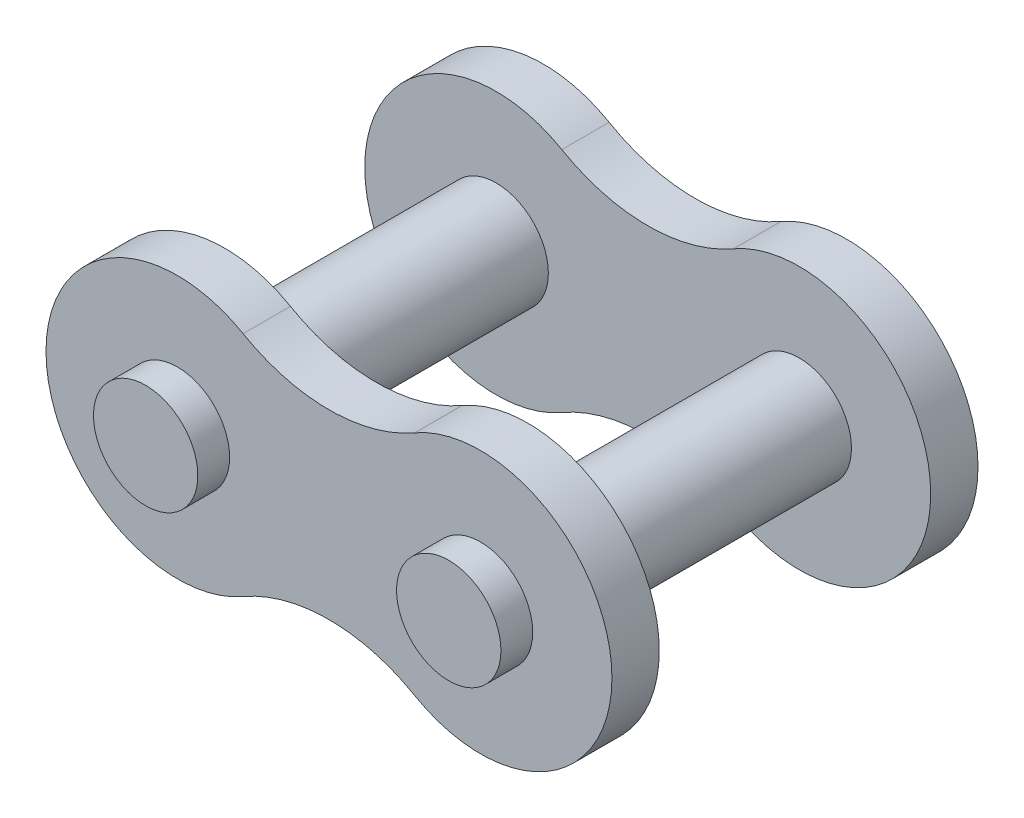
ISO-10303-21;
HEADER;
FILE_DESCRIPTION(('STEP AP214'),'2;1');
FILE_NAME('part.step','',(''),(''),'','','');
FILE_SCHEMA(('AUTOMOTIVE_DESIGN { 1 0 10303 214 1 1 1 1 }'));
ENDSEC;
DATA;
#1=APPLICATION_CONTEXT('core data for automotive mechanical design processes');
#2=APPLICATION_PROTOCOL_DEFINITION('international standard','automotive_design',2000,#1);
#3=PRODUCT_CONTEXT('',#1,'mechanical');
#4=PRODUCT('Part','Part','',(#3));
#5=PRODUCT_RELATED_PRODUCT_CATEGORY('part','',(#4));
#6=PRODUCT_DEFINITION_FORMATION('','',#4);
#7=PRODUCT_DEFINITION_CONTEXT('part definition',#1,'design');
#8=PRODUCT_DEFINITION('design','',#6,#7);
#9=PRODUCT_DEFINITION_SHAPE('','',#8);
#10=(LENGTH_UNIT() NAMED_UNIT(*) SI_UNIT(.MILLI.,.METRE.));
#11=(NAMED_UNIT(*) PLANE_ANGLE_UNIT() SI_UNIT($,.RADIAN.));
#12=(NAMED_UNIT(*) SI_UNIT($,.STERADIAN.) SOLID_ANGLE_UNIT());
#13=UNCERTAINTY_MEASURE_WITH_UNIT(LENGTH_MEASURE(1.E-05),#10,'distance_accuracy_value','');
#14=(GEOMETRIC_REPRESENTATION_CONTEXT(3) GLOBAL_UNCERTAINTY_ASSIGNED_CONTEXT((#13)) GLOBAL_UNIT_ASSIGNED_CONTEXT((#10,
#11,#12)) REPRESENTATION_CONTEXT('',''));
#15=CARTESIAN_POINT('',(0.,0.,0.));
#16=DIRECTION('',(0.,0.,1.));
#17=DIRECTION('',(1.,0.,0.));
#18=AXIS2_PLACEMENT_3D('',#15,#16,#17);
#19=CARTESIAN_POINT('',(9.525,0.,-4.265));
#20=DIRECTION('',(0.,0.,-1.));
#21=DIRECTION('',(1.,0.,0.));
#22=AXIS2_PLACEMENT_3D('',#19,#20,#21);
#23=CYLINDRICAL_SURFACE('',#22,4.13);
#24=DIRECTION('',(0.,0.,1.));
#25=VECTOR('',#24,1.);
#26=CARTESIAN_POINT('',(11.5889165792235,-3.5773102121575,-5.752));
#27=LINE('',#26,#25);
#28=CARTESIAN_POINT('',(11.5889165792235,-3.5773102121575,-5.752));
#29=VERTEX_POINT('',#28);
#30=CARTESIAN_POINT('',(11.5889165792235,-3.5773102121575,-4.265));
#31=VERTEX_POINT('',#30);
#32=EDGE_CURVE('E136',#29,#31,#27,.T.);
#33=ORIENTED_EDGE('',*,*,#32,.T.);
#34=CARTESIAN_POINT('',(9.525,0.,-4.265));
#35=DIRECTION('',(0.,0.,1.));
#36=DIRECTION('',(1.,0.,0.));
#37=AXIS2_PLACEMENT_3D('',#34,#35,#36);
#38=CIRCLE('',#37,4.13);
#39=CARTESIAN_POINT('',(11.5889165792235,3.5773102121575,-4.265));
#40=VERTEX_POINT('',#39);
#41=EDGE_CURVE('E143',#40,#31,#38,.T.);
#42=ORIENTED_EDGE('',*,*,#41,.F.);
#43=DIRECTION('',(0.,0.,1.));
#44=VECTOR('',#43,1.);
#45=CARTESIAN_POINT('',(11.5889165792235,3.5773102121575,-5.752));
#46=LINE('',#45,#44);
#47=CARTESIAN_POINT('',(11.5889165792235,3.5773102121575,-5.752));
#48=VERTEX_POINT('',#47);
#49=EDGE_CURVE('E125',#48,#40,#46,.T.);
#50=ORIENTED_EDGE('',*,*,#49,.F.);
#51=CARTESIAN_POINT('',(9.525,0.,-5.752));
#52=DIRECTION('',(0.,0.,1.));
#53=DIRECTION('',(1.,0.,0.));
#54=AXIS2_PLACEMENT_3D('',#51,#52,#53);
#55=CIRCLE('',#54,4.13);
#56=EDGE_CURVE('E144',#48,#29,#55,.T.);
#57=ORIENTED_EDGE('',*,*,#56,.T.);
#58=EDGE_LOOP('',(#33,#42,#50,#57));
#59=FACE_BOUND('',#58,.T.);
#60=ADVANCED_FACE('F36',(#59),#23,.T.);
#61=CARTESIAN_POINT('',(9.525,0.,4.265));
#62=DIRECTION('',(0.,0.,1.));
#63=DIRECTION('',(-1.,0.,0.));
#64=AXIS2_PLACEMENT_3D('',#61,#62,#63);
#65=CYLINDRICAL_SURFACE('',#64,4.13);
#66=CARTESIAN_POINT('',(9.525,0.,4.265));
#67=DIRECTION('',(0.,0.,1.));
#68=DIRECTION('',(1.,0.,0.));
#69=AXIS2_PLACEMENT_3D('',#66,#67,#68);
#70=CIRCLE('',#69,4.13);
#71=CARTESIAN_POINT('',(11.5889165792235,3.5773102121575,4.265));
#72=VERTEX_POINT('',#71);
#73=CARTESIAN_POINT('',(11.5889165792235,-3.5773102121575,4.265));
#74=VERTEX_POINT('',#73);
#75=EDGE_CURVE('E11',#72,#74,#70,.T.);
#76=ORIENTED_EDGE('',*,*,#75,.T.);
#77=DIRECTION('',(0.,0.,-1.));
#78=VECTOR('',#77,1.);
#79=CARTESIAN_POINT('',(11.5889165792235,-3.5773102121575,5.752));
#80=LINE('',#79,#78);
#81=CARTESIAN_POINT('',(11.5889165792235,-3.5773102121575,5.752));
#82=VERTEX_POINT('',#81);
#83=EDGE_CURVE('E53',#82,#74,#80,.T.);
#84=ORIENTED_EDGE('',*,*,#83,.F.);
#85=CARTESIAN_POINT('',(9.525,0.,5.752));
#86=DIRECTION('',(0.,0.,1.));
#87=DIRECTION('',(1.,0.,0.));
#88=AXIS2_PLACEMENT_3D('',#85,#86,#87);
#89=CIRCLE('',#88,4.13);
#90=CARTESIAN_POINT('',(11.5889165792235,3.5773102121575,5.752));
#91=VERTEX_POINT('',#90);
#92=EDGE_CURVE('E111',#91,#82,#89,.T.);
#93=ORIENTED_EDGE('',*,*,#92,.F.);
#94=DIRECTION('',(0.,0.,-1.));
#95=VECTOR('',#94,1.);
#96=CARTESIAN_POINT('',(11.5889165792235,3.5773102121575,5.752));
#97=LINE('',#96,#95);
#98=EDGE_CURVE('E46',#91,#72,#97,.T.);
#99=ORIENTED_EDGE('',*,*,#98,.T.);
#100=EDGE_LOOP('',(#76,#84,#93,#99));
#101=FACE_BOUND('',#100,.T.);
#102=ADVANCED_FACE('F225',(#101),#65,.T.);
#103=CARTESIAN_POINT('',(19.05,0.,-5.752));
#104=DIRECTION('',(0.,0.,-1.));
#105=DIRECTION('',(1.,0.,0.));
#106=AXIS2_PLACEMENT_3D('',#103,#104,#105);
#107=CYLINDRICAL_SURFACE('',#106,4.13);
#108=CARTESIAN_POINT('',(19.05,0.,-4.265));
#109=DIRECTION('',(0.,0.,1.));
#110=DIRECTION('',(1.,0.,0.));
#111=AXIS2_PLACEMENT_3D('',#108,#109,#110);
#112=CIRCLE('',#111,4.13);
#113=CARTESIAN_POINT('',(16.9860834207765,-3.5773102121575,-4.265));
#114=VERTEX_POINT('',#113);
#115=CARTESIAN_POINT('',(16.9860834207765,3.5773102121575,-4.265));
#116=VERTEX_POINT('',#115);
#117=EDGE_CURVE('E96',#114,#116,#112,.T.);
#118=ORIENTED_EDGE('',*,*,#117,.F.);
#119=DIRECTION('',(0.,0.,1.));
#120=VECTOR('',#119,1.);
#121=CARTESIAN_POINT('',(16.9860834207765,-3.5773102121575,-5.752));
#122=LINE('',#121,#120);
#123=CARTESIAN_POINT('',(16.9860834207765,-3.5773102121575,-5.752));
#124=VERTEX_POINT('',#123);
#125=EDGE_CURVE('E100',#124,#114,#122,.T.);
#126=ORIENTED_EDGE('',*,*,#125,.F.);
#127=CARTESIAN_POINT('',(19.05,0.,-5.752));
#128=DIRECTION('',(0.,0.,1.));
#129=DIRECTION('',(1.,0.,0.));
#130=AXIS2_PLACEMENT_3D('',#127,#128,#129);
#131=CIRCLE('',#130,4.13);
#132=CARTESIAN_POINT('',(16.9860834207765,3.5773102121575,-5.752));
#133=VERTEX_POINT('',#132);
#134=EDGE_CURVE('E131',#124,#133,#131,.T.);
#135=ORIENTED_EDGE('',*,*,#134,.T.);
#136=DIRECTION('',(0.,0.,1.));
#137=VECTOR('',#136,1.);
#138=CARTESIAN_POINT('',(16.9860834207765,3.5773102121575,-5.752));
#139=LINE('',#138,#137);
#140=EDGE_CURVE('E129',#133,#116,#139,.T.);
#141=ORIENTED_EDGE('',*,*,#140,.T.);
#142=EDGE_LOOP('',(#118,#126,#135,#141));
#143=FACE_BOUND('',#142,.T.);
#144=ADVANCED_FACE('F178',(#143),#107,.T.);
#145=CARTESIAN_POINT('',(14.2875,-8.25466496897361,-5.752));
#146=DIRECTION('',(0.,0.,-1.));
#147=DIRECTION('',(1.,0.,0.));
#148=AXIS2_PLACEMENT_3D('',#145,#146,#147);
#149=CYLINDRICAL_SURFACE('',#148,5.4);
#150=CARTESIAN_POINT('',(14.2875,-8.25466496897361,-4.265));
#151=DIRECTION('',(0.,0.,1.));
#152=DIRECTION('',(1.,0.,0.));
#153=AXIS2_PLACEMENT_3D('',#150,#151,#152);
#154=CIRCLE('',#153,5.4);
#155=EDGE_CURVE('E132',#114,#31,#154,.T.);
#156=ORIENTED_EDGE('',*,*,#155,.T.);
#157=ORIENTED_EDGE('',*,*,#32,.F.);
#158=CARTESIAN_POINT('',(14.2875,-8.25466496897361,-5.752));
#159=DIRECTION('',(0.,0.,1.));
#160=DIRECTION('',(1.,0.,0.));
#161=AXIS2_PLACEMENT_3D('',#158,#159,#160);
#162=CIRCLE('',#161,5.4);
#163=EDGE_CURVE('E137',#124,#29,#162,.T.);
#164=ORIENTED_EDGE('',*,*,#163,.F.);
#165=ORIENTED_EDGE('',*,*,#125,.T.);
#166=EDGE_LOOP('',(#156,#157,#164,#165));
#167=FACE_BOUND('',#166,.T.);
#168=ADVANCED_FACE('F172',(#167),#149,.F.);
#169=CARTESIAN_POINT('',(14.2875,8.25466496897361,-5.752));
#170=DIRECTION('',(0.,0.,-1.));
#171=DIRECTION('',(1.,0.,0.));
#172=AXIS2_PLACEMENT_3D('',#169,#170,#171);
#173=CYLINDRICAL_SURFACE('',#172,5.4);
#174=CARTESIAN_POINT('',(14.2875,8.25466496897361,-4.265));
#175=DIRECTION('',(0.,0.,1.));
#176=DIRECTION('',(1.,0.,0.));
#177=AXIS2_PLACEMENT_3D('',#174,#175,#176);
#178=CIRCLE('',#177,5.4);
#179=EDGE_CURVE('E128',#40,#116,#178,.T.);
#180=ORIENTED_EDGE('',*,*,#179,.T.);
#181=ORIENTED_EDGE('',*,*,#140,.F.);
#182=CARTESIAN_POINT('',(14.2875,8.25466496897361,-5.752));
#183=DIRECTION('',(0.,0.,1.));
#184=DIRECTION('',(1.,0.,0.));
#185=AXIS2_PLACEMENT_3D('',#182,#183,#184);
#186=CIRCLE('',#185,5.4);
#187=EDGE_CURVE('E140',#48,#133,#186,.T.);
#188=ORIENTED_EDGE('',*,*,#187,.F.);
#189=ORIENTED_EDGE('',*,*,#49,.T.);
#190=EDGE_LOOP('',(#180,#181,#188,#189));
#191=FACE_BOUND('',#190,.T.);
#192=ADVANCED_FACE('F181',(#191),#173,.F.);
#193=CARTESIAN_POINT('',(7.885,0.,-6.75));
#194=DIRECTION('',(0.,0.,1.));
#195=DIRECTION('',(1.,0.,0.));
#196=AXIS2_PLACEMENT_3D('',#193,#194,#195);
#197=PLANE('',#196);
#198=CARTESIAN_POINT('',(9.525,0.,-6.75));
#199=DIRECTION('',(0.,0.,-1.));
#200=DIRECTION('',(-1.,0.,0.));
#201=AXIS2_PLACEMENT_3D('',#198,#199,#200);
#202=CIRCLE('',#201,1.64);
#203=CARTESIAN_POINT('',(7.885,0.,-6.75));
#204=VERTEX_POINT('',#203);
#205=EDGE_CURVE('E114',#204,#204,#202,.T.);
#206=ORIENTED_EDGE('',*,*,#205,.T.);
#207=EDGE_LOOP('',(#206));
#208=FACE_BOUND('',#207,.T.);
#209=ADVANCED_FACE('F268',(#208),#197,.F.);
#210=CARTESIAN_POINT('',(9.525,0.,-6.75));
#211=DIRECTION('',(0.,0.,1.));
#212=DIRECTION('',(-1.,0.,0.));
#213=AXIS2_PLACEMENT_3D('',#210,#211,#212);
#214=CYLINDRICAL_SURFACE('',#213,1.64);
#215=CARTESIAN_POINT('',(9.525,0.,-5.752));
#216=DIRECTION('',(0.,0.,1.));
#217=DIRECTION('',(1.,0.,0.));
#218=AXIS2_PLACEMENT_3D('',#215,#216,#217);
#219=CIRCLE('',#218,1.64);
#220=CARTESIAN_POINT('',(11.165,0.,-5.752));
#221=VERTEX_POINT('',#220);
#222=EDGE_CURVE('E141',#221,#221,#219,.T.);
#223=ORIENTED_EDGE('',*,*,#222,.F.);
#224=EDGE_LOOP('',(#223));
#225=FACE_BOUND('',#224,.T.);
#226=ORIENTED_EDGE('',*,*,#205,.F.);
#227=EDGE_LOOP('',(#226));
#228=FACE_BOUND('',#227,.T.);
#229=ADVANCED_FACE('F264',(#225,#228),#214,.T.);
#230=CARTESIAN_POINT('',(9.525,0.,-6.75));
#231=DIRECTION('',(0.,0.,1.));
#232=DIRECTION('',(-1.,0.,0.));
#233=AXIS2_PLACEMENT_3D('',#230,#231,#232);
#234=CYLINDRICAL_SURFACE('',#233,1.64);
#235=CARTESIAN_POINT('',(9.525,0.,6.75));
#236=DIRECTION('',(0.,0.,-1.));
#237=DIRECTION('',(-1.,0.,0.));
#238=AXIS2_PLACEMENT_3D('',#235,#236,#237);
#239=CIRCLE('',#238,1.64);
#240=CARTESIAN_POINT('',(7.885,0.,6.75));
#241=VERTEX_POINT('',#240);
#242=EDGE_CURVE('E110',#241,#241,#239,.T.);
#243=ORIENTED_EDGE('',*,*,#242,.T.);
#244=EDGE_LOOP('',(#243));
#245=FACE_BOUND('',#244,.T.);
#246=CARTESIAN_POINT('',(9.525,0.,5.752));
#247=DIRECTION('',(0.,0.,1.));
#248=DIRECTION('',(1.,0.,0.));
#249=AXIS2_PLACEMENT_3D('',#246,#247,#248);
#250=CIRCLE('',#249,1.64);
#251=CARTESIAN_POINT('',(11.165,0.,5.752));
#252=VERTEX_POINT('',#251);
#253=EDGE_CURVE('E107',#252,#252,#250,.T.);
#254=ORIENTED_EDGE('',*,*,#253,.T.);
#255=EDGE_LOOP('',(#254));
#256=FACE_BOUND('',#255,.T.);
#257=ADVANCED_FACE('F267',(#245,#256),#234,.T.);
#258=CARTESIAN_POINT('',(9.525,0.,6.75));
#259=DIRECTION('',(0.,0.,-1.));
#260=DIRECTION('',(0.,-1.,0.));
#261=AXIS2_PLACEMENT_3D('',#258,#259,#260);
#262=PLANE('',#261);
#263=ORIENTED_EDGE('',*,*,#242,.F.);
#264=EDGE_LOOP('',(#263));
#265=FACE_BOUND('',#264,.T.);
#266=ADVANCED_FACE('F287',(#265),#262,.F.);
#267=CARTESIAN_POINT('',(16.66875,4.12733248448681,5.752));
#268=DIRECTION('',(0.,0.,1.));
#269=DIRECTION('',(1.,0.,0.));
#270=AXIS2_PLACEMENT_3D('',#267,#268,#269);
#271=PLANE('',#270);
#272=CARTESIAN_POINT('',(14.2875,8.25466496897361,5.752));
#273=DIRECTION('',(0.,0.,1.));
#274=DIRECTION('',(1.,0.,0.));
#275=AXIS2_PLACEMENT_3D('',#272,#273,#274);
#276=CIRCLE('',#275,5.4);
#277=CARTESIAN_POINT('',(16.9860834207765,3.5773102121575,5.752));
#278=VERTEX_POINT('',#277);
#279=EDGE_CURVE('E190',#91,#278,#276,.T.);
#280=ORIENTED_EDGE('',*,*,#279,.F.);
#281=ORIENTED_EDGE('',*,*,#92,.T.);
#282=CARTESIAN_POINT('',(14.2875,-8.25466496897361,5.752));
#283=DIRECTION('',(0.,0.,1.));
#284=DIRECTION('',(1.,0.,0.));
#285=AXIS2_PLACEMENT_3D('',#282,#283,#284);
#286=CIRCLE('',#285,5.4);
#287=CARTESIAN_POINT('',(16.9860834207765,-3.5773102121575,5.752));
#288=VERTEX_POINT('',#287);
#289=EDGE_CURVE('E123',#288,#82,#286,.T.);
#290=ORIENTED_EDGE('',*,*,#289,.F.);
#291=CARTESIAN_POINT('',(19.05,0.,5.752));
#292=DIRECTION('',(0.,0.,1.));
#293=DIRECTION('',(1.,0.,0.));
#294=AXIS2_PLACEMENT_3D('',#291,#292,#293);
#295=CIRCLE('',#294,4.13);
#296=EDGE_CURVE('E116',#288,#278,#295,.T.);
#297=ORIENTED_EDGE('',*,*,#296,.T.);
#298=EDGE_LOOP('',(#280,#281,#290,#297));
#299=FACE_BOUND('',#298,.T.);
#300=CARTESIAN_POINT('',(19.05,0.,5.752));
#301=DIRECTION('',(0.,0.,1.));
#302=DIRECTION('',(1.,0.,0.));
#303=AXIS2_PLACEMENT_3D('',#300,#301,#302);
#304=CIRCLE('',#303,1.64);
#305=CARTESIAN_POINT('',(20.69,0.,5.752));
#306=VERTEX_POINT('',#305);
#307=EDGE_CURVE('E164',#306,#306,#304,.T.);
#308=ORIENTED_EDGE('',*,*,#307,.F.);
#309=EDGE_LOOP('',(#308));
#310=FACE_BOUND('',#309,.T.);
#311=ORIENTED_EDGE('',*,*,#253,.F.);
#312=EDGE_LOOP('',(#311));
#313=FACE_BOUND('',#312,.T.);
#314=ADVANCED_FACE('F108',(#299,#310,#313),#271,.T.);
#315=CARTESIAN_POINT('',(16.66875,4.12733248448681,4.265));
#316=DIRECTION('',(0.,0.,1.));
#317=DIRECTION('',(1.,0.,0.));
#318=AXIS2_PLACEMENT_3D('',#315,#316,#317);
#319=PLANE('',#318);
#320=CARTESIAN_POINT('',(14.2875,-8.25466496897361,4.265));
#321=DIRECTION('',(0.,0.,1.));
#322=DIRECTION('',(1.,0.,0.));
#323=AXIS2_PLACEMENT_3D('',#320,#321,#322);
#324=CIRCLE('',#323,5.4);
#325=CARTESIAN_POINT('',(16.9860834207765,-3.5773102121575,4.265));
#326=VERTEX_POINT('',#325);
#327=EDGE_CURVE('E163',#326,#74,#324,.T.);
#328=ORIENTED_EDGE('',*,*,#327,.T.);
#329=ORIENTED_EDGE('',*,*,#75,.F.);
#330=CARTESIAN_POINT('',(14.2875,8.25466496897361,4.265));
#331=DIRECTION('',(0.,0.,1.));
#332=DIRECTION('',(1.,0.,0.));
#333=AXIS2_PLACEMENT_3D('',#330,#331,#332);
#334=CIRCLE('',#333,5.4);
#335=CARTESIAN_POINT('',(16.9860834207765,3.5773102121575,4.265));
#336=VERTEX_POINT('',#335);
#337=EDGE_CURVE('E160',#72,#336,#334,.T.);
#338=ORIENTED_EDGE('',*,*,#337,.T.);
#339=CARTESIAN_POINT('',(19.05,0.,4.265));
#340=DIRECTION('',(0.,0.,1.));
#341=DIRECTION('',(1.,0.,0.));
#342=AXIS2_PLACEMENT_3D('',#339,#340,#341);
#343=CIRCLE('',#342,4.13);
#344=EDGE_CURVE('E124',#326,#336,#343,.T.);
#345=ORIENTED_EDGE('',*,*,#344,.F.);
#346=EDGE_LOOP('',(#328,#329,#338,#345));
#347=FACE_BOUND('',#346,.T.);
#348=CARTESIAN_POINT('',(19.05,0.,4.265));
#349=DIRECTION('',(0.,0.,1.));
#350=DIRECTION('',(1.,0.,0.));
#351=AXIS2_PLACEMENT_3D('',#348,#349,#350);
#352=CIRCLE('',#351,1.64);
#353=CARTESIAN_POINT('',(20.69,0.,4.265));
#354=VERTEX_POINT('',#353);
#355=EDGE_CURVE('E192',#354,#354,#352,.T.);
#356=ORIENTED_EDGE('',*,*,#355,.T.);
#357=EDGE_LOOP('',(#356));
#358=FACE_BOUND('',#357,.T.);
#359=CARTESIAN_POINT('',(9.525,0.,4.265));
#360=DIRECTION('',(0.,0.,1.));
#361=DIRECTION('',(1.,0.,0.));
#362=AXIS2_PLACEMENT_3D('',#359,#360,#361);
#363=CIRCLE('',#362,1.64);
#364=CARTESIAN_POINT('',(11.165,0.,4.265));
#365=VERTEX_POINT('',#364);
#366=EDGE_CURVE('E236',#365,#365,#363,.T.);
#367=ORIENTED_EDGE('',*,*,#366,.T.);
#368=EDGE_LOOP('',(#367));
#369=FACE_BOUND('',#368,.T.);
#370=ADVANCED_FACE('F230',(#347,#358,#369),#319,.F.);
#371=CARTESIAN_POINT('',(14.2875,-8.25466496897361,5.752));
#372=DIRECTION('',(0.,0.,1.));
#373=DIRECTION('',(-1.,0.,0.));
#374=AXIS2_PLACEMENT_3D('',#371,#372,#373);
#375=CYLINDRICAL_SURFACE('',#374,5.4);
#376=ORIENTED_EDGE('',*,*,#327,.F.);
#377=DIRECTION('',(0.,0.,-1.));
#378=VECTOR('',#377,1.);
#379=CARTESIAN_POINT('',(16.9860834207765,-3.5773102121575,5.752));
#380=LINE('',#379,#378);
#381=EDGE_CURVE('E120',#288,#326,#380,.T.);
#382=ORIENTED_EDGE('',*,*,#381,.F.);
#383=ORIENTED_EDGE('',*,*,#289,.T.);
#384=ORIENTED_EDGE('',*,*,#83,.T.);
#385=EDGE_LOOP('',(#376,#382,#383,#384));
#386=FACE_BOUND('',#385,.T.);
#387=ADVANCED_FACE('F229',(#386),#375,.F.);
#388=CARTESIAN_POINT('',(19.05,0.,5.752));
#389=DIRECTION('',(0.,0.,1.));
#390=DIRECTION('',(-1.,0.,0.));
#391=AXIS2_PLACEMENT_3D('',#388,#389,#390);
#392=CYLINDRICAL_SURFACE('',#391,4.13);
#393=ORIENTED_EDGE('',*,*,#344,.T.);
#394=DIRECTION('',(0.,0.,-1.));
#395=VECTOR('',#394,1.);
#396=CARTESIAN_POINT('',(16.9860834207765,3.5773102121575,5.752));
#397=LINE('',#396,#395);
#398=EDGE_CURVE('E40',#278,#336,#397,.T.);
#399=ORIENTED_EDGE('',*,*,#398,.F.);
#400=ORIENTED_EDGE('',*,*,#296,.F.);
#401=ORIENTED_EDGE('',*,*,#381,.T.);
#402=EDGE_LOOP('',(#393,#399,#400,#401));
#403=FACE_BOUND('',#402,.T.);
#404=ADVANCED_FACE('F215',(#403),#392,.T.);
#405=CARTESIAN_POINT('',(14.2875,8.25466496897361,5.752));
#406=DIRECTION('',(0.,0.,1.));
#407=DIRECTION('',(-1.,0.,0.));
#408=AXIS2_PLACEMENT_3D('',#405,#406,#407);
#409=CYLINDRICAL_SURFACE('',#408,5.4);
#410=ORIENTED_EDGE('',*,*,#337,.F.);
#411=ORIENTED_EDGE('',*,*,#98,.F.);
#412=ORIENTED_EDGE('',*,*,#279,.T.);
#413=ORIENTED_EDGE('',*,*,#398,.T.);
#414=EDGE_LOOP('',(#410,#411,#412,#413));
#415=FACE_BOUND('',#414,.T.);
#416=ADVANCED_FACE('F218',(#415),#409,.F.);
#417=CARTESIAN_POINT('',(16.66875,4.12733248448681,-5.752));
#418=DIRECTION('',(0.,0.,1.));
#419=DIRECTION('',(1.,0.,0.));
#420=AXIS2_PLACEMENT_3D('',#417,#418,#419);
#421=PLANE('',#420);
#422=ORIENTED_EDGE('',*,*,#187,.T.);
#423=ORIENTED_EDGE('',*,*,#134,.F.);
#424=ORIENTED_EDGE('',*,*,#163,.T.);
#425=ORIENTED_EDGE('',*,*,#56,.F.);
#426=EDGE_LOOP('',(#422,#423,#424,#425));
#427=FACE_BOUND('',#426,.T.);
#428=CARTESIAN_POINT('',(19.05,0.,-5.752));
#429=DIRECTION('',(0.,0.,1.));
#430=DIRECTION('',(1.,0.,0.));
#431=AXIS2_PLACEMENT_3D('',#428,#429,#430);
#432=CIRCLE('',#431,1.64);
#433=CARTESIAN_POINT('',(20.69,0.,-5.752));
#434=VERTEX_POINT('',#433);
#435=EDGE_CURVE('E196',#434,#434,#432,.T.);
#436=ORIENTED_EDGE('',*,*,#435,.T.);
#437=EDGE_LOOP('',(#436));
#438=FACE_BOUND('',#437,.T.);
#439=ORIENTED_EDGE('',*,*,#222,.T.);
#440=EDGE_LOOP('',(#439));
#441=FACE_BOUND('',#440,.T.);
#442=ADVANCED_FACE('F258',(#427,#438,#441),#421,.F.);
#443=CARTESIAN_POINT('',(16.66875,4.12733248448681,-4.265));
#444=DIRECTION('',(0.,0.,1.));
#445=DIRECTION('',(1.,0.,0.));
#446=AXIS2_PLACEMENT_3D('',#443,#444,#445);
#447=PLANE('',#446);
#448=ORIENTED_EDGE('',*,*,#179,.F.);
#449=ORIENTED_EDGE('',*,*,#41,.T.);
#450=ORIENTED_EDGE('',*,*,#155,.F.);
#451=ORIENTED_EDGE('',*,*,#117,.T.);
#452=EDGE_LOOP('',(#448,#449,#450,#451));
#453=FACE_BOUND('',#452,.T.);
#454=CARTESIAN_POINT('',(19.05,0.,-4.265));
#455=DIRECTION('',(0.,0.,1.));
#456=DIRECTION('',(1.,0.,0.));
#457=AXIS2_PLACEMENT_3D('',#454,#455,#456);
#458=CIRCLE('',#457,1.64);
#459=CARTESIAN_POINT('',(20.69,0.,-4.265));
#460=VERTEX_POINT('',#459);
#461=EDGE_CURVE('E176',#460,#460,#458,.T.);
#462=ORIENTED_EDGE('',*,*,#461,.F.);
#463=EDGE_LOOP('',(#462));
#464=FACE_BOUND('',#463,.T.);
#465=CARTESIAN_POINT('',(9.525,0.,-4.265));
#466=DIRECTION('',(0.,0.,1.));
#467=DIRECTION('',(1.,0.,0.));
#468=AXIS2_PLACEMENT_3D('',#465,#466,#467);
#469=CIRCLE('',#468,1.64);
#470=CARTESIAN_POINT('',(11.165,0.,-4.265));
#471=VERTEX_POINT('',#470);
#472=EDGE_CURVE('E238',#471,#471,#469,.F.);
#473=ORIENTED_EDGE('',*,*,#472,.T.);
#474=EDGE_LOOP('',(#473));
#475=FACE_BOUND('',#474,.T.);
#476=ADVANCED_FACE('F38',(#453,#464,#475),#447,.T.);
#477=CARTESIAN_POINT('',(19.05,0.,-11.3886204845838));
#478=DIRECTION('',(0.,0.,1.));
#479=DIRECTION('',(1.,0.,0.));
#480=AXIS2_PLACEMENT_3D('',#477,#478,#479);
#481=CYLINDRICAL_SURFACE('',#480,1.64);
#482=ORIENTED_EDGE('',*,*,#461,.T.);
#483=EDGE_LOOP('',(#482));
#484=FACE_BOUND('',#483,.T.);
#485=ORIENTED_EDGE('',*,*,#355,.F.);
#486=EDGE_LOOP('',(#485));
#487=FACE_BOUND('',#486,.T.);
#488=ADVANCED_FACE('F255',(#484,#487),#481,.T.);
#489=CARTESIAN_POINT('',(7.885,0.,-6.75));
#490=DIRECTION('',(0.,0.,1.));
#491=DIRECTION('',(1.,0.,0.));
#492=AXIS2_PLACEMENT_3D('',#489,#490,#491);
#493=PLANE('',#492);
#494=CARTESIAN_POINT('',(19.05,0.,-6.75));
#495=DIRECTION('',(0.,0.,1.));
#496=DIRECTION('',(1.,0.,0.));
#497=AXIS2_PLACEMENT_3D('',#494,#495,#496);
#498=CIRCLE('',#497,1.64);
#499=CARTESIAN_POINT('',(20.69,0.,-6.75));
#500=VERTEX_POINT('',#499);
#501=EDGE_CURVE('E201',#500,#500,#498,.F.);
#502=ORIENTED_EDGE('',*,*,#501,.T.);
#503=EDGE_LOOP('',(#502));
#504=FACE_BOUND('',#503,.T.);
#505=ADVANCED_FACE('F248',(#504),#493,.F.);
#506=ORIENTED_EDGE('',*,*,#501,.F.);
#507=EDGE_LOOP('',(#506));
#508=FACE_BOUND('',#507,.T.);
#509=ORIENTED_EDGE('',*,*,#435,.F.);
#510=EDGE_LOOP('',(#509));
#511=FACE_BOUND('',#510,.T.);
#512=ADVANCED_FACE('F250',(#508,#511),#481,.T.);
#513=ORIENTED_EDGE('',*,*,#307,.T.);
#514=EDGE_LOOP('',(#513));
#515=FACE_BOUND('',#514,.T.);
#516=CARTESIAN_POINT('',(19.05,0.,6.75));
#517=DIRECTION('',(0.,0.,1.));
#518=DIRECTION('',(1.,0.,0.));
#519=AXIS2_PLACEMENT_3D('',#516,#517,#518);
#520=CIRCLE('',#519,1.64);
#521=CARTESIAN_POINT('',(20.69,0.,6.75));
#522=VERTEX_POINT('',#521);
#523=EDGE_CURVE('E241',#522,#522,#520,.T.);
#524=ORIENTED_EDGE('',*,*,#523,.F.);
#525=EDGE_LOOP('',(#524));
#526=FACE_BOUND('',#525,.T.);
#527=ADVANCED_FACE('F253',(#515,#526),#481,.T.);
#528=CARTESIAN_POINT('',(19.05,0.,6.75));
#529=DIRECTION('',(0.,0.,1.));
#530=DIRECTION('',(1.,0.,0.));
#531=AXIS2_PLACEMENT_3D('',#528,#529,#530);
#532=PLANE('',#531);
#533=ORIENTED_EDGE('',*,*,#523,.T.);
#534=EDGE_LOOP('',(#533));
#535=FACE_BOUND('',#534,.T.);
#536=ADVANCED_FACE('F306',(#535),#532,.T.);
#537=CARTESIAN_POINT('',(9.525,0.,-23.8745340332197));
#538=DIRECTION('',(0.,0.,1.));
#539=DIRECTION('',(1.,0.,0.));
#540=AXIS2_PLACEMENT_3D('',#537,#538,#539);
#541=CYLINDRICAL_SURFACE('',#540,1.64);
#542=CARTESIAN_POINT('',(11.165,0.,-4.265));
#543=CARTESIAN_POINT('',(11.165,0.,-4.17614583333333));
#544=CARTESIAN_POINT('',(11.165,0.,-4.08729166666667));
#545=CARTESIAN_POINT('',(11.165,0.,-3.90958333333333));
#546=CARTESIAN_POINT('',(11.165,0.,-3.82072916666667));
#547=CARTESIAN_POINT('',(11.165,0.,-3.64302083333334));
#548=CARTESIAN_POINT('',(11.165,0.,-3.55416666666667));
#549=CARTESIAN_POINT('',(11.165,0.,-3.37645833333333));
#550=CARTESIAN_POINT('',(11.165,0.,-3.28760416666667));
#551=CARTESIAN_POINT('',(11.165,0.,-3.10989583333333));
#552=CARTESIAN_POINT('',(11.165,0.,-3.02104166666667));
#553=CARTESIAN_POINT('',(11.165,0.,-2.84333333333334));
#554=CARTESIAN_POINT('',(11.165,0.,-2.75447916666667));
#555=CARTESIAN_POINT('',(11.165,0.,-2.57677083333333));
#556=CARTESIAN_POINT('',(11.165,0.,-2.48791666666667));
#557=CARTESIAN_POINT('',(11.165,0.,-2.31020833333333));
#558=CARTESIAN_POINT('',(11.165,0.,-2.22135416666667));
#559=CARTESIAN_POINT('',(11.165,0.,-2.04364583333333));
#560=CARTESIAN_POINT('',(11.165,0.,-1.95479166666667));
#561=CARTESIAN_POINT('',(11.165,0.,-1.77708333333333));
#562=CARTESIAN_POINT('',(11.165,0.,-1.68822916666667));
#563=CARTESIAN_POINT('',(11.165,0.,-1.51052083333333));
#564=CARTESIAN_POINT('',(11.165,0.,-1.42166666666667));
#565=CARTESIAN_POINT('',(11.165,0.,-1.24395833333333));
#566=CARTESIAN_POINT('',(11.165,0.,-1.15510416666667));
#567=CARTESIAN_POINT('',(11.165,0.,-0.977395833333334));
#568=CARTESIAN_POINT('',(11.165,0.,-0.888541666666667));
#569=CARTESIAN_POINT('',(11.165,0.,-0.710833333333333));
#570=CARTESIAN_POINT('',(11.165,0.,-0.621979166666666));
#571=CARTESIAN_POINT('',(11.165,0.,-0.444270833333333));
#572=CARTESIAN_POINT('',(11.165,0.,-0.355416666666667));
#573=CARTESIAN_POINT('',(11.165,0.,-0.177708333333334));
#574=CARTESIAN_POINT('',(11.165,0.,-0.0888541666666671));
#575=CARTESIAN_POINT('',(11.165,0.,0.0888541666666671));
#576=CARTESIAN_POINT('',(11.165,0.,0.177708333333334));
#577=CARTESIAN_POINT('',(11.165,0.,0.355416666666667));
#578=CARTESIAN_POINT('',(11.165,0.,0.444270833333333));
#579=CARTESIAN_POINT('',(11.165,0.,0.621979166666666));
#580=CARTESIAN_POINT('',(11.165,0.,0.710833333333333));
#581=CARTESIAN_POINT('',(11.165,0.,0.888541666666667));
#582=CARTESIAN_POINT('',(11.165,0.,0.977395833333334));
#583=CARTESIAN_POINT('',(11.165,0.,1.15510416666667));
#584=CARTESIAN_POINT('',(11.165,0.,1.24395833333333));
#585=CARTESIAN_POINT('',(11.165,0.,1.42166666666667));
#586=CARTESIAN_POINT('',(11.165,0.,1.51052083333333));
#587=CARTESIAN_POINT('',(11.165,0.,1.68822916666667));
#588=CARTESIAN_POINT('',(11.165,0.,1.77708333333333));
#589=CARTESIAN_POINT('',(11.165,0.,1.95479166666667));
#590=CARTESIAN_POINT('',(11.165,0.,2.04364583333333));
#591=CARTESIAN_POINT('',(11.165,0.,2.22135416666667));
#592=CARTESIAN_POINT('',(11.165,0.,2.31020833333333));
#593=CARTESIAN_POINT('',(11.165,0.,2.48791666666667));
#594=CARTESIAN_POINT('',(11.165,0.,2.57677083333333));
#595=CARTESIAN_POINT('',(11.165,0.,2.75447916666667));
#596=CARTESIAN_POINT('',(11.165,0.,2.84333333333333));
#597=CARTESIAN_POINT('',(11.165,0.,3.02104166666667));
#598=CARTESIAN_POINT('',(11.165,0.,3.10989583333333));
#599=CARTESIAN_POINT('',(11.165,0.,3.28760416666667));
#600=CARTESIAN_POINT('',(11.165,0.,3.37645833333333));
#601=CARTESIAN_POINT('',(11.165,0.,3.55416666666667));
#602=CARTESIAN_POINT('',(11.165,0.,3.64302083333333));
#603=CARTESIAN_POINT('',(11.165,0.,3.82072916666667));
#604=CARTESIAN_POINT('',(11.165,0.,3.90958333333334));
#605=CARTESIAN_POINT('',(11.165,0.,4.08729166666667));
#606=CARTESIAN_POINT('',(11.165,0.,4.17614583333334));
#607=CARTESIAN_POINT('',(11.165,0.,4.265));
#608=B_SPLINE_CURVE_WITH_KNOTS('',3,(#542,#543,#544,#545,#546,#547,#548,#549,#550,#551,#552,
#553,#554,#555,#556,#557,#558,#559,#560,#561,#562,#563,#564,#565,#566,#567,#568,#569,#570,#571,
#572,#573,#574,#575,#576,#577,#578,#579,#580,#581,#582,#583,#584,#585,#586,#587,#588,#589,#590,
#591,#592,#593,#594,#595,#596,#597,#598,#599,#600,#601,#602,#603,#604,#605,#606,#607),
.UNSPECIFIED.,.F.,.F.,(4,2,2,2,2,2,2,2,2,2,2,2,2,2,2,2,2,2,2,2,2,2,2,2,2,2,2,2,2,2,2,2,4),(0.,
0.266562500000001,0.533124999999999,0.7996875,1.06625,1.3328125,1.599375,1.8659375,2.1325,
2.3990625,2.665625,2.9321875,3.19875,3.4653125,3.731875,3.9984375,4.265,4.5315625,4.798125,
5.0646875,5.33125,5.5978125,5.864375,6.1309375,6.3975,6.6640625,6.930625,7.1971875,7.46375,
7.7303125,7.996875,8.26343750000001,8.53),.UNSPECIFIED.);
#609=EDGE_CURVE('BSEAM310',#471,#365,#608,.T.);
#610=ORIENTED_EDGE('',*,*,#472,.F.);
#611=ORIENTED_EDGE('',*,*,#366,.F.);
#612=ORIENTED_EDGE('',*,*,#609,.T.);
#613=ORIENTED_EDGE('',*,*,#609,.F.);
#614=EDGE_LOOP('',(#610,#612,#611,#613));
#615=FACE_BOUND('',#614,.T.);
#616=ADVANCED_FACE('F310',(#615),#541,.T.);
#617=CLOSED_SHELL('',(#60,#102,#144,#168,#192,#209,#229,#257,#266,#314,#370,#387,#404,#416,#442,
#476,#488,#505,#512,#527,#536,#616));
#618=MANIFOLD_SOLID_BREP('B2',#617);
#619=ADVANCED_BREP_SHAPE_REPRESENTATION('',(#18,#618),#14);
#620=SHAPE_DEFINITION_REPRESENTATION(#9,#619);
ENDSEC;
END-ISO-10303-21;
